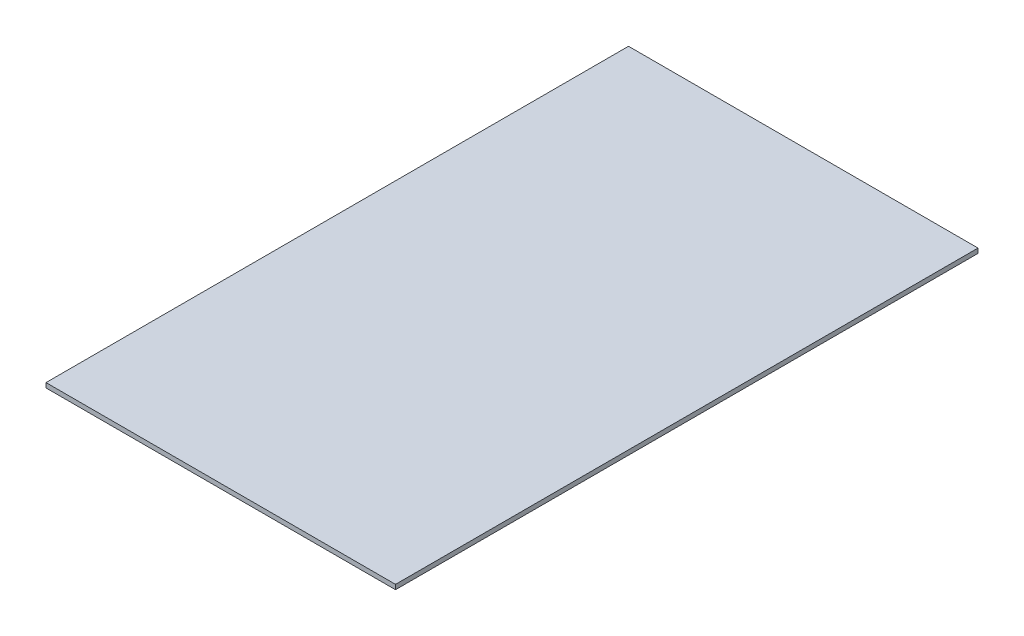
ISO-10303-21;
HEADER;
FILE_DESCRIPTION(('STEP AP214'),'2;1');
FILE_NAME('part.step','',(''),(''),'','','');
FILE_SCHEMA(('AUTOMOTIVE_DESIGN { 1 0 10303 214 1 1 1 1 }'));
ENDSEC;
DATA;
#1=APPLICATION_CONTEXT('core data for automotive mechanical design processes');
#2=APPLICATION_PROTOCOL_DEFINITION('international standard','automotive_design',2000,#1);
#3=PRODUCT_CONTEXT('',#1,'mechanical');
#4=PRODUCT('Part','Part','',(#3));
#5=PRODUCT_RELATED_PRODUCT_CATEGORY('part','',(#4));
#6=PRODUCT_DEFINITION_FORMATION('','',#4);
#7=PRODUCT_DEFINITION_CONTEXT('part definition',#1,'design');
#8=PRODUCT_DEFINITION('design','',#6,#7);
#9=PRODUCT_DEFINITION_SHAPE('','',#8);
#10=(LENGTH_UNIT() NAMED_UNIT(*) SI_UNIT(.MILLI.,.METRE.));
#11=(NAMED_UNIT(*) PLANE_ANGLE_UNIT() SI_UNIT($,.RADIAN.));
#12=(NAMED_UNIT(*) SI_UNIT($,.STERADIAN.) SOLID_ANGLE_UNIT());
#13=UNCERTAINTY_MEASURE_WITH_UNIT(LENGTH_MEASURE(1.E-05),#10,'distance_accuracy_value','');
#14=(GEOMETRIC_REPRESENTATION_CONTEXT(3) GLOBAL_UNCERTAINTY_ASSIGNED_CONTEXT((#13)) GLOBAL_UNIT_ASSIGNED_CONTEXT((#10,
#11,#12)) REPRESENTATION_CONTEXT('',''));
#15=CARTESIAN_POINT('',(0.,0.,0.));
#16=DIRECTION('',(0.,0.,1.));
#17=DIRECTION('',(1.,0.,0.));
#18=AXIS2_PLACEMENT_3D('',#15,#16,#17);
#19=CARTESIAN_POINT('',(225.,6.,375.));
#20=DIRECTION('',(-1.,0.,0.));
#21=DIRECTION('',(0.,0.,1.));
#22=AXIS2_PLACEMENT_3D('',#19,#20,#21);
#23=PLANE('',#22);
#24=DIRECTION('',(0.,0.,-1.));
#25=VECTOR('',#24,1.);
#26=CARTESIAN_POINT('',(225.,0.,375.));
#27=LINE('',#26,#25);
#28=CARTESIAN_POINT('',(225.,0.,375.));
#29=VERTEX_POINT('',#28);
#30=CARTESIAN_POINT('',(225.,0.,-375.));
#31=VERTEX_POINT('',#30);
#32=EDGE_CURVE('E95',#29,#31,#27,.T.);
#33=ORIENTED_EDGE('',*,*,#32,.T.);
#34=DIRECTION('',(0.,-1.,0.));
#35=VECTOR('',#34,1.);
#36=CARTESIAN_POINT('',(225.,6.,-375.));
#37=LINE('',#36,#35);
#38=CARTESIAN_POINT('',(225.,6.,-375.));
#39=VERTEX_POINT('',#38);
#40=EDGE_CURVE('E11',#39,#31,#37,.T.);
#41=ORIENTED_EDGE('',*,*,#40,.F.);
#42=DIRECTION('',(0.,0.,-1.));
#43=VECTOR('',#42,1.);
#44=CARTESIAN_POINT('',(225.,6.,375.));
#45=LINE('',#44,#43);
#46=CARTESIAN_POINT('',(225.,6.,375.));
#47=VERTEX_POINT('',#46);
#48=EDGE_CURVE('E83',#47,#39,#45,.T.);
#49=ORIENTED_EDGE('',*,*,#48,.F.);
#50=DIRECTION('',(0.,-1.,0.));
#51=VECTOR('',#50,1.);
#52=CARTESIAN_POINT('',(225.,6.,375.));
#53=LINE('',#52,#51);
#54=EDGE_CURVE('E91',#47,#29,#53,.T.);
#55=ORIENTED_EDGE('',*,*,#54,.T.);
#56=EDGE_LOOP('',(#33,#41,#49,#55));
#57=FACE_BOUND('',#56,.T.);
#58=ADVANCED_FACE('F32',(#57),#23,.F.);
#59=CARTESIAN_POINT('',(-225.,6.,-375.));
#60=DIRECTION('',(0.,0.,1.));
#61=DIRECTION('',(1.,0.,0.));
#62=AXIS2_PLACEMENT_3D('',#59,#60,#61);
#63=PLANE('',#62);
#64=DIRECTION('',(-1.,0.,0.));
#65=VECTOR('',#64,1.);
#66=CARTESIAN_POINT('',(-225.,0.,-375.));
#67=LINE('',#66,#65);
#68=CARTESIAN_POINT('',(-225.,0.,-375.));
#69=VERTEX_POINT('',#68);
#70=EDGE_CURVE('E87',#31,#69,#67,.T.);
#71=ORIENTED_EDGE('',*,*,#70,.T.);
#72=DIRECTION('',(0.,-1.,0.));
#73=VECTOR('',#72,1.);
#74=CARTESIAN_POINT('',(-225.,6.,-375.));
#75=LINE('',#74,#73);
#76=CARTESIAN_POINT('',(-225.,6.,-375.));
#77=VERTEX_POINT('',#76);
#78=EDGE_CURVE('E40',#77,#69,#75,.T.);
#79=ORIENTED_EDGE('',*,*,#78,.F.);
#80=DIRECTION('',(-1.,0.,0.));
#81=VECTOR('',#80,1.);
#82=CARTESIAN_POINT('',(-225.,6.,-375.));
#83=LINE('',#82,#81);
#84=EDGE_CURVE('E78',#39,#77,#83,.T.);
#85=ORIENTED_EDGE('',*,*,#84,.F.);
#86=ORIENTED_EDGE('',*,*,#40,.T.);
#87=EDGE_LOOP('',(#71,#79,#85,#86));
#88=FACE_BOUND('',#87,.T.);
#89=ADVANCED_FACE('F86',(#88),#63,.F.);
#90=CARTESIAN_POINT('',(-225.,6.,375.));
#91=DIRECTION('',(1.,0.,0.));
#92=DIRECTION('',(0.,0.,-1.));
#93=AXIS2_PLACEMENT_3D('',#90,#91,#92);
#94=PLANE('',#93);
#95=DIRECTION('',(0.,0.,1.));
#96=VECTOR('',#95,1.);
#97=CARTESIAN_POINT('',(-225.,0.,375.));
#98=LINE('',#97,#96);
#99=CARTESIAN_POINT('',(-225.,0.,375.));
#100=VERTEX_POINT('',#99);
#101=EDGE_CURVE('E65',#69,#100,#98,.T.);
#102=ORIENTED_EDGE('',*,*,#101,.T.);
#103=DIRECTION('',(0.,-1.,0.));
#104=VECTOR('',#103,1.);
#105=CARTESIAN_POINT('',(-225.,6.,375.));
#106=LINE('',#105,#104);
#107=CARTESIAN_POINT('',(-225.,6.,375.));
#108=VERTEX_POINT('',#107);
#109=EDGE_CURVE('E88',#108,#100,#106,.T.);
#110=ORIENTED_EDGE('',*,*,#109,.F.);
#111=DIRECTION('',(0.,0.,1.));
#112=VECTOR('',#111,1.);
#113=CARTESIAN_POINT('',(-225.,6.,375.));
#114=LINE('',#113,#112);
#115=EDGE_CURVE('E81',#77,#108,#114,.T.);
#116=ORIENTED_EDGE('',*,*,#115,.F.);
#117=ORIENTED_EDGE('',*,*,#78,.T.);
#118=EDGE_LOOP('',(#102,#110,#116,#117));
#119=FACE_BOUND('',#118,.T.);
#120=ADVANCED_FACE('F89',(#119),#94,.F.);
#121=CARTESIAN_POINT('',(-225.,6.,375.));
#122=DIRECTION('',(0.,0.,-1.));
#123=DIRECTION('',(-1.,0.,0.));
#124=AXIS2_PLACEMENT_3D('',#121,#122,#123);
#125=PLANE('',#124);
#126=DIRECTION('',(1.,0.,0.));
#127=VECTOR('',#126,1.);
#128=CARTESIAN_POINT('',(-225.,0.,375.));
#129=LINE('',#128,#127);
#130=EDGE_CURVE('E71',#100,#29,#129,.T.);
#131=ORIENTED_EDGE('',*,*,#130,.T.);
#132=ORIENTED_EDGE('',*,*,#54,.F.);
#133=DIRECTION('',(1.,0.,0.));
#134=VECTOR('',#133,1.);
#135=CARTESIAN_POINT('',(-225.,6.,375.));
#136=LINE('',#135,#134);
#137=EDGE_CURVE('E48',#108,#47,#136,.T.);
#138=ORIENTED_EDGE('',*,*,#137,.F.);
#139=ORIENTED_EDGE('',*,*,#109,.T.);
#140=EDGE_LOOP('',(#131,#132,#138,#139));
#141=FACE_BOUND('',#140,.T.);
#142=ADVANCED_FACE('F102',(#141),#125,.F.);
#143=CARTESIAN_POINT('',(0.,6.,0.));
#144=DIRECTION('',(0.,-1.,0.));
#145=DIRECTION('',(0.,0.,-1.));
#146=AXIS2_PLACEMENT_3D('',#143,#144,#145);
#147=PLANE('',#146);
#148=ORIENTED_EDGE('',*,*,#48,.T.);
#149=ORIENTED_EDGE('',*,*,#84,.T.);
#150=ORIENTED_EDGE('',*,*,#115,.T.);
#151=ORIENTED_EDGE('',*,*,#137,.T.);
#152=EDGE_LOOP('',(#148,#149,#150,#151));
#153=FACE_BOUND('',#152,.T.);
#154=ADVANCED_FACE('F79',(#153),#147,.F.);
#155=CARTESIAN_POINT('',(0.,0.,0.));
#156=DIRECTION('',(0.,-1.,0.));
#157=DIRECTION('',(0.,0.,-1.));
#158=AXIS2_PLACEMENT_3D('',#155,#156,#157);
#159=PLANE('',#158);
#160=ORIENTED_EDGE('',*,*,#32,.F.);
#161=ORIENTED_EDGE('',*,*,#130,.F.);
#162=ORIENTED_EDGE('',*,*,#101,.F.);
#163=ORIENTED_EDGE('',*,*,#70,.F.);
#164=EDGE_LOOP('',(#160,#161,#162,#163));
#165=FACE_BOUND('',#164,.T.);
#166=ADVANCED_FACE('F105',(#165),#159,.T.);
#167=CLOSED_SHELL('',(#58,#89,#120,#142,#154,#166));
#168=MANIFOLD_SOLID_BREP('B2',#167);
#169=ADVANCED_BREP_SHAPE_REPRESENTATION('',(#18,#168),#14);
#170=SHAPE_DEFINITION_REPRESENTATION(#9,#169);
ENDSEC;
END-ISO-10303-21;
